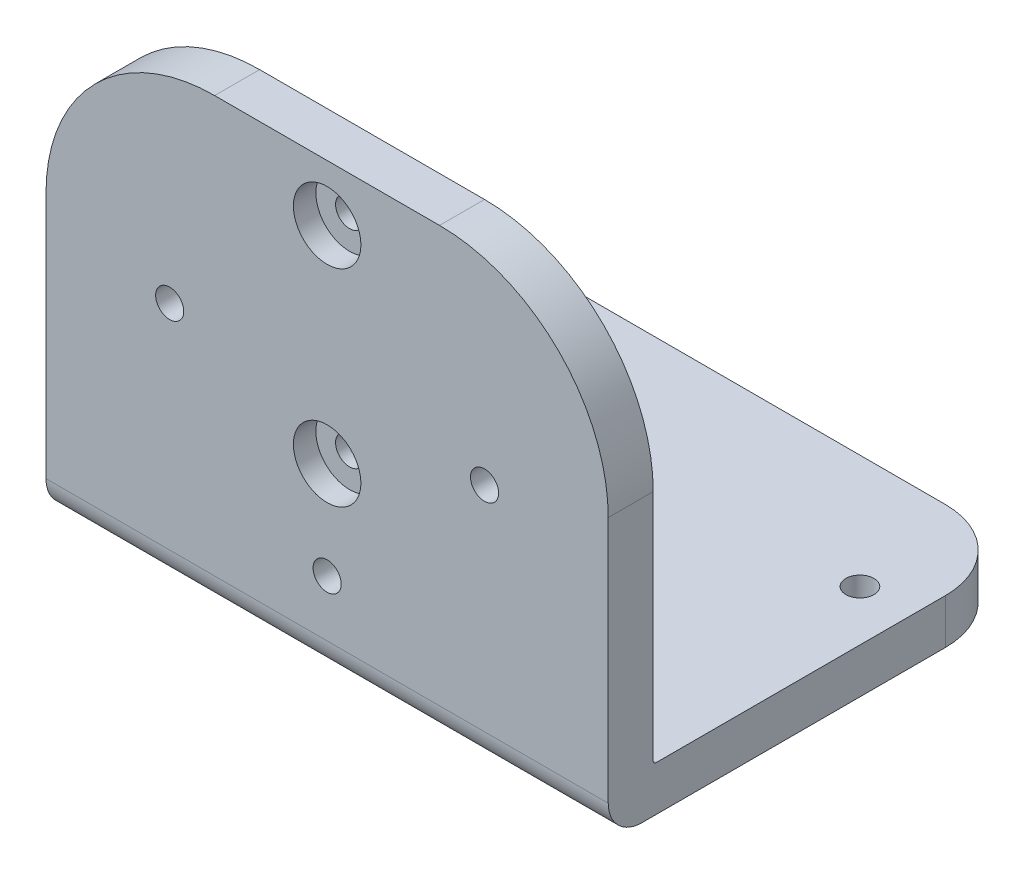
ISO-10303-21;
HEADER;
FILE_DESCRIPTION(('STEP AP214'),'2;1');
FILE_NAME('part.step','',(''),(''),'','','');
FILE_SCHEMA(('AUTOMOTIVE_DESIGN { 1 0 10303 214 1 1 1 1 }'));
ENDSEC;
DATA;
#1=APPLICATION_CONTEXT('core data for automotive mechanical design processes');
#2=APPLICATION_PROTOCOL_DEFINITION('international standard','automotive_design',2000,#1);
#3=PRODUCT_CONTEXT('',#1,'mechanical');
#4=PRODUCT('Part','Part','',(#3));
#5=PRODUCT_RELATED_PRODUCT_CATEGORY('part','',(#4));
#6=PRODUCT_DEFINITION_FORMATION('','',#4);
#7=PRODUCT_DEFINITION_CONTEXT('part definition',#1,'design');
#8=PRODUCT_DEFINITION('design','',#6,#7);
#9=PRODUCT_DEFINITION_SHAPE('','',#8);
#10=(LENGTH_UNIT() NAMED_UNIT(*) SI_UNIT(.MILLI.,.METRE.));
#11=(NAMED_UNIT(*) PLANE_ANGLE_UNIT() SI_UNIT($,.RADIAN.));
#12=(NAMED_UNIT(*) SI_UNIT($,.STERADIAN.) SOLID_ANGLE_UNIT());
#13=UNCERTAINTY_MEASURE_WITH_UNIT(LENGTH_MEASURE(1.E-05),#10,'distance_accuracy_value','');
#14=(GEOMETRIC_REPRESENTATION_CONTEXT(3) GLOBAL_UNCERTAINTY_ASSIGNED_CONTEXT((#13)) GLOBAL_UNIT_ASSIGNED_CONTEXT((#10,
#11,#12)) REPRESENTATION_CONTEXT('',''));
#15=CARTESIAN_POINT('',(0.,0.,0.));
#16=DIRECTION('',(0.,0.,1.));
#17=DIRECTION('',(1.,0.,0.));
#18=AXIS2_PLACEMENT_3D('',#15,#16,#17);
#19=CARTESIAN_POINT('',(25.,0.,0.));
#20=DIRECTION('',(0.,0.,-1.));
#21=DIRECTION('',(-1.,0.,0.));
#22=AXIS2_PLACEMENT_3D('',#19,#20,#21);
#23=PLANE('',#22);
#24=CARTESIAN_POINT('',(0.,16.65,0.));
#25=DIRECTION('',(0.,0.,-1.));
#26=DIRECTION('',(-1.,0.,0.));
#27=AXIS2_PLACEMENT_3D('',#24,#25,#26);
#28=CIRCLE('',#27,3.);
#29=CARTESIAN_POINT('',(-3.00000000000001,16.65,0.));
#30=VERTEX_POINT('',#29);
#31=EDGE_CURVE('E655',#30,#30,#28,.T.);
#32=ORIENTED_EDGE('',*,*,#31,.T.);
#33=EDGE_LOOP('',(#32));
#34=FACE_BOUND('',#33,.T.);
#35=CARTESIAN_POINT('',(0.,35.,0.));
#36=DIRECTION('',(0.,0.,-1.));
#37=DIRECTION('',(-1.,0.,0.));
#38=AXIS2_PLACEMENT_3D('',#35,#36,#37);
#39=CIRCLE('',#38,3.);
#40=CARTESIAN_POINT('',(-3.,35.,0.));
#41=VERTEX_POINT('',#40);
#42=EDGE_CURVE('E648',#41,#41,#39,.T.);
#43=ORIENTED_EDGE('',*,*,#42,.T.);
#44=EDGE_LOOP('',(#43));
#45=FACE_BOUND('',#44,.T.);
#46=CARTESIAN_POINT('',(14.,22.,0.));
#47=DIRECTION('',(0.,0.,-1.));
#48=DIRECTION('',(0.,1.,0.));
#49=AXIS2_PLACEMENT_3D('',#46,#47,#48);
#50=CIRCLE('',#49,1.25);
#51=CARTESIAN_POINT('',(14.,23.25,0.));
#52=VERTEX_POINT('',#51);
#53=EDGE_CURVE('E638',#52,#52,#50,.T.);
#54=ORIENTED_EDGE('',*,*,#53,.T.);
#55=EDGE_LOOP('',(#54));
#56=FACE_BOUND('',#55,.T.);
#57=CARTESIAN_POINT('',(-14.,22.,0.));
#58=DIRECTION('',(0.,0.,-1.));
#59=DIRECTION('',(0.,1.,0.));
#60=AXIS2_PLACEMENT_3D('',#57,#58,#59);
#61=CIRCLE('',#60,1.25);
#62=CARTESIAN_POINT('',(-14.,23.25,0.));
#63=VERTEX_POINT('',#62);
#64=EDGE_CURVE('E642',#63,#63,#61,.T.);
#65=ORIENTED_EDGE('',*,*,#64,.T.);
#66=EDGE_LOOP('',(#65));
#67=FACE_BOUND('',#66,.T.);
#68=CARTESIAN_POINT('',(0.,8.,0.));
#69=DIRECTION('',(0.,0.,-1.));
#70=DIRECTION('',(0.,1.,0.));
#71=AXIS2_PLACEMENT_3D('',#68,#69,#70);
#72=CIRCLE('',#71,1.25);
#73=CARTESIAN_POINT('',(0.,9.25,0.));
#74=VERTEX_POINT('',#73);
#75=EDGE_CURVE('E639',#74,#74,#72,.T.);
#76=ORIENTED_EDGE('',*,*,#75,.T.);
#77=EDGE_LOOP('',(#76));
#78=FACE_BOUND('',#77,.T.);
#79=DIRECTION('',(0.,-1.,0.));
#80=VECTOR('',#79,1.);
#81=CARTESIAN_POINT('',(-25.,0.,0.));
#82=LINE('',#81,#80);
#83=CARTESIAN_POINT('',(-25.,25.,0.));
#84=VERTEX_POINT('',#83);
#85=CARTESIAN_POINT('',(-25.,3.,0.));
#86=VERTEX_POINT('',#85);
#87=EDGE_CURVE('E174',#84,#86,#82,.T.);
#88=ORIENTED_EDGE('',*,*,#87,.T.);
#89=DIRECTION('',(-1.,0.,0.));
#90=VECTOR('',#89,1.);
#91=CARTESIAN_POINT('',(25.,3.,0.));
#92=LINE('',#91,#90);
#93=CARTESIAN_POINT('',(25.,3.,0.));
#94=VERTEX_POINT('',#93);
#95=EDGE_CURVE('E58',#86,#94,#92,.F.);
#96=ORIENTED_EDGE('',*,*,#95,.T.);
#97=DIRECTION('',(0.,-1.,0.));
#98=VECTOR('',#97,1.);
#99=CARTESIAN_POINT('',(25.,0.,0.));
#100=LINE('',#99,#98);
#101=CARTESIAN_POINT('',(25.,25.,0.));
#102=VERTEX_POINT('',#101);
#103=EDGE_CURVE('E152',#102,#94,#100,.T.);
#104=ORIENTED_EDGE('',*,*,#103,.F.);
#105=CARTESIAN_POINT('',(10.,25.,0.));
#106=DIRECTION('',(0.,0.,-1.));
#107=DIRECTION('',(-1.,0.,0.));
#108=AXIS2_PLACEMENT_3D('',#105,#106,#107);
#109=CIRCLE('',#108,15.);
#110=CARTESIAN_POINT('',(10.,40.,0.));
#111=VERTEX_POINT('',#110);
#112=EDGE_CURVE('E139',#102,#111,#109,.F.);
#113=ORIENTED_EDGE('',*,*,#112,.T.);
#114=DIRECTION('',(-1.,0.,0.));
#115=VECTOR('',#114,1.);
#116=CARTESIAN_POINT('',(25.,40.,0.));
#117=LINE('',#116,#115);
#118=CARTESIAN_POINT('',(-10.,40.,0.));
#119=VERTEX_POINT('',#118);
#120=EDGE_CURVE('E173',#111,#119,#117,.T.);
#121=ORIENTED_EDGE('',*,*,#120,.T.);
#122=CARTESIAN_POINT('',(-10.,25.,0.));
#123=DIRECTION('',(0.,0.,-1.));
#124=DIRECTION('',(-1.,0.,0.));
#125=AXIS2_PLACEMENT_3D('',#122,#123,#124);
#126=CIRCLE('',#125,15.);
#127=EDGE_CURVE('E148',#119,#84,#126,.F.);
#128=ORIENTED_EDGE('',*,*,#127,.T.);
#129=EDGE_LOOP('',(#88,#96,#104,#113,#121,#128));
#130=FACE_BOUND('',#129,.T.);
#131=ADVANCED_FACE('F50',(#34,#45,#56,#67,#78,#130),#23,.F.);
#132=CARTESIAN_POINT('',(25.,0.,0.));
#133=DIRECTION('',(0.,1.,0.));
#134=DIRECTION('',(0.,0.,1.));
#135=AXIS2_PLACEMENT_3D('',#132,#133,#134);
#136=PLANE('',#135);
#137=CARTESIAN_POINT('',(20.5,0.,-26.88));
#138=DIRECTION('',(0.,1.,0.));
#139=DIRECTION('',(0.,0.,1.));
#140=AXIS2_PLACEMENT_3D('',#137,#138,#139);
#141=CIRCLE('',#140,3.);
#142=CARTESIAN_POINT('',(20.5,0.,-23.88));
#143=VERTEX_POINT('',#142);
#144=EDGE_CURVE('E177',#143,#143,#141,.T.);
#145=ORIENTED_EDGE('',*,*,#144,.T.);
#146=EDGE_LOOP('',(#145));
#147=FACE_BOUND('',#146,.T.);
#148=CARTESIAN_POINT('',(-15.5,0.,-26.88));
#149=DIRECTION('',(0.,1.,0.));
#150=DIRECTION('',(0.,0.,1.));
#151=AXIS2_PLACEMENT_3D('',#148,#149,#150);
#152=CIRCLE('',#151,3.);
#153=CARTESIAN_POINT('',(-15.5,0.,-23.88));
#154=VERTEX_POINT('',#153);
#155=EDGE_CURVE('E602',#154,#154,#152,.T.);
#156=ORIENTED_EDGE('',*,*,#155,.T.);
#157=EDGE_LOOP('',(#156));
#158=FACE_BOUND('',#157,.T.);
#159=DIRECTION('',(0.,0.,-1.));
#160=VECTOR('',#159,1.);
#161=CARTESIAN_POINT('',(25.,0.,0.));
#162=LINE('',#161,#160);
#163=CARTESIAN_POINT('',(25.,0.,-3.));
#164=VERTEX_POINT('',#163);
#165=CARTESIAN_POINT('',(25.,0.,-30.));
#166=VERTEX_POINT('',#165);
#167=EDGE_CURVE('E159',#164,#166,#162,.T.);
#168=ORIENTED_EDGE('',*,*,#167,.F.);
#169=DIRECTION('',(-1.,0.,0.));
#170=VECTOR('',#169,1.);
#171=CARTESIAN_POINT('',(25.,0.,-3.));
#172=LINE('',#171,#170);
#173=CARTESIAN_POINT('',(-25.,0.,-3.));
#174=VERTEX_POINT('',#173);
#175=EDGE_CURVE('E230',#164,#174,#172,.T.);
#176=ORIENTED_EDGE('',*,*,#175,.T.);
#177=DIRECTION('',(0.,0.,-1.));
#178=VECTOR('',#177,1.);
#179=CARTESIAN_POINT('',(-25.,0.,0.));
#180=LINE('',#179,#178);
#181=CARTESIAN_POINT('',(-25.,0.,-30.));
#182=VERTEX_POINT('',#181);
#183=EDGE_CURVE('E176',#174,#182,#180,.T.);
#184=ORIENTED_EDGE('',*,*,#183,.T.);
#185=CARTESIAN_POINT('',(-18.,0.,-30.));
#186=DIRECTION('',(0.,1.,0.));
#187=DIRECTION('',(0.,0.,1.));
#188=AXIS2_PLACEMENT_3D('',#185,#186,#187);
#189=CIRCLE('',#188,7.);
#190=CARTESIAN_POINT('',(-18.,0.,-37.));
#191=VERTEX_POINT('',#190);
#192=EDGE_CURVE('E216',#182,#191,#189,.F.);
#193=ORIENTED_EDGE('',*,*,#192,.T.);
#194=DIRECTION('',(-1.,0.,0.));
#195=VECTOR('',#194,1.);
#196=CARTESIAN_POINT('',(25.,0.,-37.));
#197=LINE('',#196,#195);
#198=CARTESIAN_POINT('',(18.,0.,-37.));
#199=VERTEX_POINT('',#198);
#200=EDGE_CURVE('E157',#199,#191,#197,.T.);
#201=ORIENTED_EDGE('',*,*,#200,.F.);
#202=CARTESIAN_POINT('',(18.,0.,-30.));
#203=DIRECTION('',(0.,1.,0.));
#204=DIRECTION('',(0.,0.,1.));
#205=AXIS2_PLACEMENT_3D('',#202,#203,#204);
#206=CIRCLE('',#205,7.);
#207=EDGE_CURVE('E213',#199,#166,#206,.F.);
#208=ORIENTED_EDGE('',*,*,#207,.T.);
#209=EDGE_LOOP('',(#168,#176,#184,#193,#201,#208));
#210=FACE_BOUND('',#209,.T.);
#211=ADVANCED_FACE('F236',(#147,#158,#210),#136,.F.);
#212=CARTESIAN_POINT('',(25.,4.,-37.));
#213=DIRECTION('',(0.,0.,1.));
#214=DIRECTION('',(1.,0.,0.));
#215=AXIS2_PLACEMENT_3D('',#212,#213,#214);
#216=PLANE('',#215);
#217=ORIENTED_EDGE('',*,*,#200,.T.);
#218=DIRECTION('',(0.,1.,0.));
#219=VECTOR('',#218,1.);
#220=CARTESIAN_POINT('',(-18.,4.,-37.));
#221=LINE('',#220,#219);
#222=CARTESIAN_POINT('',(-18.,4.,-37.));
#223=VERTEX_POINT('',#222);
#224=EDGE_CURVE('E203',#191,#223,#221,.T.);
#225=ORIENTED_EDGE('',*,*,#224,.T.);
#226=DIRECTION('',(-1.,0.,0.));
#227=VECTOR('',#226,1.);
#228=CARTESIAN_POINT('',(25.,4.,-37.));
#229=LINE('',#228,#227);
#230=CARTESIAN_POINT('',(18.,4.,-37.));
#231=VERTEX_POINT('',#230);
#232=EDGE_CURVE('E185',#231,#223,#229,.T.);
#233=ORIENTED_EDGE('',*,*,#232,.F.);
#234=DIRECTION('',(0.,1.,0.));
#235=VECTOR('',#234,1.);
#236=CARTESIAN_POINT('',(18.,4.,-37.));
#237=LINE('',#236,#235);
#238=EDGE_CURVE('E201',#231,#199,#237,.F.);
#239=ORIENTED_EDGE('',*,*,#238,.T.);
#240=EDGE_LOOP('',(#217,#225,#233,#239));
#241=FACE_BOUND('',#240,.T.);
#242=ADVANCED_FACE('F248',(#241),#216,.F.);
#243=CARTESIAN_POINT('',(25.,4.,-4.));
#244=DIRECTION('',(0.,-1.,0.));
#245=DIRECTION('',(0.,0.,-1.));
#246=AXIS2_PLACEMENT_3D('',#243,#244,#245);
#247=PLANE('',#246);
#248=CARTESIAN_POINT('',(20.5,4.,-26.88));
#249=DIRECTION('',(0.,1.,0.));
#250=DIRECTION('',(0.,0.,1.));
#251=AXIS2_PLACEMENT_3D('',#248,#249,#250);
#252=CIRCLE('',#251,1.25);
#253=CARTESIAN_POINT('',(20.5,4.,-25.63));
#254=VERTEX_POINT('',#253);
#255=EDGE_CURVE('E585',#254,#254,#252,.T.);
#256=ORIENTED_EDGE('',*,*,#255,.F.);
#257=EDGE_LOOP('',(#256));
#258=FACE_BOUND('',#257,.T.);
#259=CARTESIAN_POINT('',(-15.5,4.,-26.88));
#260=DIRECTION('',(0.,1.,0.));
#261=DIRECTION('',(0.,0.,1.));
#262=AXIS2_PLACEMENT_3D('',#259,#260,#261);
#263=CIRCLE('',#262,1.25);
#264=CARTESIAN_POINT('',(-15.5,4.,-25.63));
#265=VERTEX_POINT('',#264);
#266=EDGE_CURVE('E592',#265,#265,#263,.T.);
#267=ORIENTED_EDGE('',*,*,#266,.F.);
#268=EDGE_LOOP('',(#267));
#269=FACE_BOUND('',#268,.T.);
#270=DIRECTION('',(0.,0.,1.));
#271=VECTOR('',#270,1.);
#272=CARTESIAN_POINT('',(-25.,4.,-4.));
#273=LINE('',#272,#271);
#274=CARTESIAN_POINT('',(-25.,4.,-30.));
#275=VERTEX_POINT('',#274);
#276=CARTESIAN_POINT('',(-25.,4.,-4.25));
#277=VERTEX_POINT('',#276);
#278=EDGE_CURVE('E164',#275,#277,#273,.T.);
#279=ORIENTED_EDGE('',*,*,#278,.T.);
#280=DIRECTION('',(-1.,0.,0.));
#281=VECTOR('',#280,1.);
#282=CARTESIAN_POINT('',(25.,4.,-4.25));
#283=LINE('',#282,#281);
#284=CARTESIAN_POINT('',(25.,4.,-4.25));
#285=VERTEX_POINT('',#284);
#286=EDGE_CURVE('E224',#277,#285,#283,.F.);
#287=ORIENTED_EDGE('',*,*,#286,.T.);
#288=DIRECTION('',(0.,0.,1.));
#289=VECTOR('',#288,1.);
#290=CARTESIAN_POINT('',(25.,4.,-4.));
#291=LINE('',#290,#289);
#292=CARTESIAN_POINT('',(25.,4.,-30.));
#293=VERTEX_POINT('',#292);
#294=EDGE_CURVE('E162',#293,#285,#291,.T.);
#295=ORIENTED_EDGE('',*,*,#294,.F.);
#296=CARTESIAN_POINT('',(18.,4.,-30.));
#297=DIRECTION('',(0.,-1.,0.));
#298=DIRECTION('',(0.,0.,-1.));
#299=AXIS2_PLACEMENT_3D('',#296,#297,#298);
#300=CIRCLE('',#299,7.);
#301=EDGE_CURVE('E206',#293,#231,#300,.F.);
#302=ORIENTED_EDGE('',*,*,#301,.T.);
#303=ORIENTED_EDGE('',*,*,#232,.T.);
#304=CARTESIAN_POINT('',(-18.,4.,-30.));
#305=DIRECTION('',(0.,-1.,0.));
#306=DIRECTION('',(0.,0.,-1.));
#307=AXIS2_PLACEMENT_3D('',#304,#305,#306);
#308=CIRCLE('',#307,7.);
#309=EDGE_CURVE('E208',#223,#275,#308,.F.);
#310=ORIENTED_EDGE('',*,*,#309,.T.);
#311=EDGE_LOOP('',(#279,#287,#295,#302,#303,#310));
#312=FACE_BOUND('',#311,.T.);
#313=ADVANCED_FACE('F257',(#258,#269,#312),#247,.F.);
#314=CARTESIAN_POINT('',(25.,40.,-4.));
#315=DIRECTION('',(0.,0.,1.));
#316=DIRECTION('',(0.,-1.,0.));
#317=AXIS2_PLACEMENT_3D('',#314,#315,#316);
#318=PLANE('',#317);
#319=CARTESIAN_POINT('',(0.,35.,-4.));
#320=DIRECTION('',(0.,0.,-1.));
#321=DIRECTION('',(0.,1.,0.));
#322=AXIS2_PLACEMENT_3D('',#319,#320,#321);
#323=CIRCLE('',#322,1.25);
#324=CARTESIAN_POINT('',(0.,36.25,-4.));
#325=VERTEX_POINT('',#324);
#326=EDGE_CURVE('E558',#325,#325,#323,.T.);
#327=ORIENTED_EDGE('',*,*,#326,.F.);
#328=EDGE_LOOP('',(#327));
#329=FACE_BOUND('',#328,.T.);
#330=CARTESIAN_POINT('',(0.,16.65,-4.));
#331=DIRECTION('',(0.,0.,-1.));
#332=DIRECTION('',(0.,1.,0.));
#333=AXIS2_PLACEMENT_3D('',#330,#331,#332);
#334=CIRCLE('',#333,1.25);
#335=CARTESIAN_POINT('',(0.,17.9,-4.));
#336=VERTEX_POINT('',#335);
#337=EDGE_CURVE('E562',#336,#336,#334,.T.);
#338=ORIENTED_EDGE('',*,*,#337,.F.);
#339=EDGE_LOOP('',(#338));
#340=FACE_BOUND('',#339,.T.);
#341=CARTESIAN_POINT('',(-14.,22.,-4.));
#342=DIRECTION('',(0.,0.,-1.));
#343=DIRECTION('',(0.,1.,0.));
#344=AXIS2_PLACEMENT_3D('',#341,#342,#343);
#345=CIRCLE('',#344,3.);
#346=CARTESIAN_POINT('',(-14.,25.,-4.));
#347=VERTEX_POINT('',#346);
#348=EDGE_CURVE('E566',#347,#347,#345,.T.);
#349=ORIENTED_EDGE('',*,*,#348,.F.);
#350=EDGE_LOOP('',(#349));
#351=FACE_BOUND('',#350,.T.);
#352=CARTESIAN_POINT('',(14.,22.,-4.));
#353=DIRECTION('',(0.,0.,-1.));
#354=DIRECTION('',(0.,1.,0.));
#355=AXIS2_PLACEMENT_3D('',#352,#353,#354);
#356=CIRCLE('',#355,3.);
#357=CARTESIAN_POINT('',(14.,25.,-4.));
#358=VERTEX_POINT('',#357);
#359=EDGE_CURVE('E570',#358,#358,#356,.T.);
#360=ORIENTED_EDGE('',*,*,#359,.F.);
#361=EDGE_LOOP('',(#360));
#362=FACE_BOUND('',#361,.T.);
#363=CARTESIAN_POINT('',(0.,8.,-4.));
#364=DIRECTION('',(0.,0.,-1.));
#365=DIRECTION('',(0.,1.,0.));
#366=AXIS2_PLACEMENT_3D('',#363,#364,#365);
#367=CIRCLE('',#366,3.);
#368=CARTESIAN_POINT('',(0.,11.,-4.));
#369=VERTEX_POINT('',#368);
#370=EDGE_CURVE('E573',#369,#369,#367,.T.);
#371=ORIENTED_EDGE('',*,*,#370,.F.);
#372=EDGE_LOOP('',(#371));
#373=FACE_BOUND('',#372,.T.);
#374=DIRECTION('',(0.,1.,0.));
#375=VECTOR('',#374,1.);
#376=CARTESIAN_POINT('',(25.,40.,-4.));
#377=LINE('',#376,#375);
#378=CARTESIAN_POINT('',(25.,4.25,-4.));
#379=VERTEX_POINT('',#378);
#380=CARTESIAN_POINT('',(25.,25.,-4.));
#381=VERTEX_POINT('',#380);
#382=EDGE_CURVE('E155',#379,#381,#377,.T.);
#383=ORIENTED_EDGE('',*,*,#382,.F.);
#384=DIRECTION('',(-1.,0.,0.));
#385=VECTOR('',#384,1.);
#386=CARTESIAN_POINT('',(-25.,4.25,-4.));
#387=LINE('',#386,#385);
#388=CARTESIAN_POINT('',(-25.,4.25,-4.));
#389=VERTEX_POINT('',#388);
#390=EDGE_CURVE('E221',#379,#389,#387,.T.);
#391=ORIENTED_EDGE('',*,*,#390,.T.);
#392=DIRECTION('',(0.,1.,0.));
#393=VECTOR('',#392,1.);
#394=CARTESIAN_POINT('',(-25.,40.,-4.));
#395=LINE('',#394,#393);
#396=CARTESIAN_POINT('',(-25.,25.,-4.));
#397=VERTEX_POINT('',#396);
#398=EDGE_CURVE('E160',#389,#397,#395,.T.);
#399=ORIENTED_EDGE('',*,*,#398,.T.);
#400=CARTESIAN_POINT('',(-10.,25.,-4.));
#401=DIRECTION('',(0.,0.,1.));
#402=DIRECTION('',(0.,-1.,0.));
#403=AXIS2_PLACEMENT_3D('',#400,#401,#402);
#404=CIRCLE('',#403,15.);
#405=CARTESIAN_POINT('',(-10.,40.,-4.));
#406=VERTEX_POINT('',#405);
#407=EDGE_CURVE('E194',#397,#406,#404,.F.);
#408=ORIENTED_EDGE('',*,*,#407,.T.);
#409=DIRECTION('',(-1.,0.,0.));
#410=VECTOR('',#409,1.);
#411=CARTESIAN_POINT('',(25.,40.,-4.));
#412=LINE('',#411,#410);
#413=CARTESIAN_POINT('',(10.,40.,-4.));
#414=VERTEX_POINT('',#413);
#415=EDGE_CURVE('E182',#414,#406,#412,.T.);
#416=ORIENTED_EDGE('',*,*,#415,.F.);
#417=CARTESIAN_POINT('',(10.,25.,-4.));
#418=DIRECTION('',(0.,0.,1.));
#419=DIRECTION('',(0.,-1.,0.));
#420=AXIS2_PLACEMENT_3D('',#417,#418,#419);
#421=CIRCLE('',#420,15.);
#422=EDGE_CURVE('E196',#414,#381,#421,.F.);
#423=ORIENTED_EDGE('',*,*,#422,.T.);
#424=EDGE_LOOP('',(#383,#391,#399,#408,#416,#423));
#425=FACE_BOUND('',#424,.T.);
#426=ADVANCED_FACE('F263',(#329,#340,#351,#362,#373,#425),#318,.F.);
#427=CARTESIAN_POINT('',(25.,40.,0.));
#428=DIRECTION('',(0.,-1.,0.));
#429=DIRECTION('',(0.,0.,-1.));
#430=AXIS2_PLACEMENT_3D('',#427,#428,#429);
#431=PLANE('',#430);
#432=ORIENTED_EDGE('',*,*,#120,.F.);
#433=DIRECTION('',(0.,0.,1.));
#434=VECTOR('',#433,1.);
#435=CARTESIAN_POINT('',(10.,40.,0.));
#436=LINE('',#435,#434);
#437=EDGE_CURVE('E144',#111,#414,#436,.F.);
#438=ORIENTED_EDGE('',*,*,#437,.T.);
#439=ORIENTED_EDGE('',*,*,#415,.T.);
#440=DIRECTION('',(0.,0.,1.));
#441=VECTOR('',#440,1.);
#442=CARTESIAN_POINT('',(-10.,40.,0.));
#443=LINE('',#442,#441);
#444=EDGE_CURVE('E147',#406,#119,#443,.T.);
#445=ORIENTED_EDGE('',*,*,#444,.T.);
#446=EDGE_LOOP('',(#432,#438,#439,#445));
#447=FACE_BOUND('',#446,.T.);
#448=ADVANCED_FACE('F269',(#447),#431,.F.);
#449=CARTESIAN_POINT('',(25.,0.,0.));
#450=DIRECTION('',(-1.,0.,0.));
#451=DIRECTION('',(0.,0.,1.));
#452=AXIS2_PLACEMENT_3D('',#449,#450,#451);
#453=PLANE('',#452);
#454=ORIENTED_EDGE('',*,*,#103,.T.);
#455=CARTESIAN_POINT('',(25.,3.,-3.));
#456=DIRECTION('',(-1.,0.,0.));
#457=DIRECTION('',(0.,0.,1.));
#458=AXIS2_PLACEMENT_3D('',#455,#456,#457);
#459=CIRCLE('',#458,3.);
#460=EDGE_CURVE('E13',#94,#164,#459,.F.);
#461=ORIENTED_EDGE('',*,*,#460,.T.);
#462=ORIENTED_EDGE('',*,*,#167,.T.);
#463=DIRECTION('',(0.,1.,0.));
#464=VECTOR('',#463,1.);
#465=CARTESIAN_POINT('',(25.,0.,-30.));
#466=LINE('',#465,#464);
#467=EDGE_CURVE('E218',#166,#293,#466,.T.);
#468=ORIENTED_EDGE('',*,*,#467,.T.);
#469=ORIENTED_EDGE('',*,*,#294,.T.);
#470=CARTESIAN_POINT('',(25.,4.25,-4.25));
#471=DIRECTION('',(-1.,0.,0.));
#472=DIRECTION('',(0.,0.,1.));
#473=AXIS2_PLACEMENT_3D('',#470,#471,#472);
#474=CIRCLE('',#473,0.25);
#475=EDGE_CURVE('E228',#285,#379,#474,.T.);
#476=ORIENTED_EDGE('',*,*,#475,.T.);
#477=ORIENTED_EDGE('',*,*,#382,.T.);
#478=DIRECTION('',(0.,0.,1.));
#479=VECTOR('',#478,1.);
#480=CARTESIAN_POINT('',(25.,25.,0.));
#481=LINE('',#480,#479);
#482=EDGE_CURVE('E143',#381,#102,#481,.T.);
#483=ORIENTED_EDGE('',*,*,#482,.T.);
#484=EDGE_LOOP('',(#454,#461,#462,#468,#469,#476,#477,#483));
#485=FACE_BOUND('',#484,.T.);
#486=ADVANCED_FACE('F151',(#485),#453,.F.);
#487=CARTESIAN_POINT('',(-25.,0.,0.));
#488=DIRECTION('',(-1.,0.,0.));
#489=DIRECTION('',(0.,0.,1.));
#490=AXIS2_PLACEMENT_3D('',#487,#488,#489);
#491=PLANE('',#490);
#492=ORIENTED_EDGE('',*,*,#183,.F.);
#493=CARTESIAN_POINT('',(-25.,3.,-3.));
#494=DIRECTION('',(-1.,0.,0.));
#495=DIRECTION('',(0.,0.,1.));
#496=AXIS2_PLACEMENT_3D('',#493,#494,#495);
#497=CIRCLE('',#496,3.);
#498=EDGE_CURVE('E72',#174,#86,#497,.T.);
#499=ORIENTED_EDGE('',*,*,#498,.T.);
#500=ORIENTED_EDGE('',*,*,#87,.F.);
#501=DIRECTION('',(0.,0.,1.));
#502=VECTOR('',#501,1.);
#503=CARTESIAN_POINT('',(-25.,25.,-4.));
#504=LINE('',#503,#502);
#505=EDGE_CURVE('E198',#84,#397,#504,.F.);
#506=ORIENTED_EDGE('',*,*,#505,.T.);
#507=ORIENTED_EDGE('',*,*,#398,.F.);
#508=CARTESIAN_POINT('',(-25.,4.25,-4.25));
#509=DIRECTION('',(-1.,0.,0.));
#510=DIRECTION('',(0.,0.,1.));
#511=AXIS2_PLACEMENT_3D('',#508,#509,#510);
#512=CIRCLE('',#511,0.25);
#513=EDGE_CURVE('E226',#389,#277,#512,.F.);
#514=ORIENTED_EDGE('',*,*,#513,.T.);
#515=ORIENTED_EDGE('',*,*,#278,.F.);
#516=DIRECTION('',(0.,1.,0.));
#517=VECTOR('',#516,1.);
#518=CARTESIAN_POINT('',(-25.,0.,-30.));
#519=LINE('',#518,#517);
#520=EDGE_CURVE('E210',#275,#182,#519,.F.);
#521=ORIENTED_EDGE('',*,*,#520,.T.);
#522=EDGE_LOOP('',(#492,#499,#500,#506,#507,#514,#515,#521));
#523=FACE_BOUND('',#522,.T.);
#524=ADVANCED_FACE('F238',(#523),#491,.T.);
#525=CARTESIAN_POINT('',(-15.5,12.4852813742386,-26.88));
#526=DIRECTION('',(0.,-1.,0.));
#527=DIRECTION('',(0.,0.,-1.));
#528=AXIS2_PLACEMENT_3D('',#525,#526,#527);
#529=CYLINDRICAL_SURFACE('',#528,3.);
#530=CARTESIAN_POINT('',(-15.5,2.,-26.88));
#531=DIRECTION('',(0.,-1.,0.));
#532=DIRECTION('',(0.,0.,-1.));
#533=AXIS2_PLACEMENT_3D('',#530,#531,#532);
#534=CIRCLE('',#533,3.);
#535=CARTESIAN_POINT('',(-15.5,2.,-29.88));
#536=VERTEX_POINT('',#535);
#537=EDGE_CURVE('E167',#536,#536,#534,.T.);
#538=ORIENTED_EDGE('',*,*,#537,.F.);
#539=EDGE_LOOP('',(#538));
#540=FACE_BOUND('',#539,.T.);
#541=ORIENTED_EDGE('',*,*,#155,.F.);
#542=EDGE_LOOP('',(#541));
#543=FACE_BOUND('',#542,.T.);
#544=ADVANCED_FACE('F341',(#540,#543),#529,.F.);
#545=CARTESIAN_POINT('',(25.,2.,-4.));
#546=DIRECTION('',(0.,-1.,0.));
#547=DIRECTION('',(0.,0.,-1.));
#548=AXIS2_PLACEMENT_3D('',#545,#546,#547);
#549=PLANE('',#548);
#550=CARTESIAN_POINT('',(-15.5,2.,-26.88));
#551=DIRECTION('',(0.,-1.,0.));
#552=DIRECTION('',(0.,0.,-1.));
#553=AXIS2_PLACEMENT_3D('',#550,#551,#552);
#554=CIRCLE('',#553,1.25);
#555=CARTESIAN_POINT('',(-15.5,2.,-28.13));
#556=VERTEX_POINT('',#555);
#557=EDGE_CURVE('E595',#556,#556,#554,.T.);
#558=ORIENTED_EDGE('',*,*,#557,.F.);
#559=EDGE_LOOP('',(#558));
#560=FACE_BOUND('',#559,.T.);
#561=ORIENTED_EDGE('',*,*,#537,.T.);
#562=EDGE_LOOP('',(#561));
#563=FACE_BOUND('',#562,.T.);
#564=ADVANCED_FACE('F354',(#560,#563),#549,.T.);
#565=CARTESIAN_POINT('',(20.5,12.4852813742386,-26.88));
#566=DIRECTION('',(0.,-1.,0.));
#567=DIRECTION('',(0.,0.,-1.));
#568=AXIS2_PLACEMENT_3D('',#565,#566,#567);
#569=CYLINDRICAL_SURFACE('',#568,3.);
#570=CARTESIAN_POINT('',(20.5,2.,-26.88));
#571=DIRECTION('',(0.,-1.,0.));
#572=DIRECTION('',(0.,0.,-1.));
#573=AXIS2_PLACEMENT_3D('',#570,#571,#572);
#574=CIRCLE('',#573,3.);
#575=CARTESIAN_POINT('',(20.5,2.,-29.88));
#576=VERTEX_POINT('',#575);
#577=EDGE_CURVE('E600',#576,#576,#574,.T.);
#578=ORIENTED_EDGE('',*,*,#577,.F.);
#579=EDGE_LOOP('',(#578));
#580=FACE_BOUND('',#579,.T.);
#581=ORIENTED_EDGE('',*,*,#144,.F.);
#582=EDGE_LOOP('',(#581));
#583=FACE_BOUND('',#582,.T.);
#584=ADVANCED_FACE('F361',(#580,#583),#569,.F.);
#585=CARTESIAN_POINT('',(25.,2.,-4.));
#586=DIRECTION('',(0.,-1.,0.));
#587=DIRECTION('',(0.,0.,-1.));
#588=AXIS2_PLACEMENT_3D('',#585,#586,#587);
#589=PLANE('',#588);
#590=CARTESIAN_POINT('',(20.5,2.,-26.88));
#591=DIRECTION('',(0.,-1.,0.));
#592=DIRECTION('',(0.,0.,-1.));
#593=AXIS2_PLACEMENT_3D('',#590,#591,#592);
#594=CIRCLE('',#593,1.25);
#595=CARTESIAN_POINT('',(20.5,2.,-28.13));
#596=VERTEX_POINT('',#595);
#597=EDGE_CURVE('E588',#596,#596,#594,.T.);
#598=ORIENTED_EDGE('',*,*,#597,.F.);
#599=EDGE_LOOP('',(#598));
#600=FACE_BOUND('',#599,.T.);
#601=ORIENTED_EDGE('',*,*,#577,.T.);
#602=EDGE_LOOP('',(#601));
#603=FACE_BOUND('',#602,.T.);
#604=ADVANCED_FACE('F369',(#600,#603),#589,.T.);
#605=CARTESIAN_POINT('',(-15.5,0.,-26.88));
#606=DIRECTION('',(0.,1.,0.));
#607=DIRECTION('',(0.,0.,1.));
#608=AXIS2_PLACEMENT_3D('',#605,#606,#607);
#609=CYLINDRICAL_SURFACE('',#608,1.25);
#610=ORIENTED_EDGE('',*,*,#557,.T.);
#611=EDGE_LOOP('',(#610));
#612=FACE_BOUND('',#611,.T.);
#613=ORIENTED_EDGE('',*,*,#266,.T.);
#614=EDGE_LOOP('',(#613));
#615=FACE_BOUND('',#614,.T.);
#616=ADVANCED_FACE('F377',(#612,#615),#609,.F.);
#617=CARTESIAN_POINT('',(20.5,0.,-26.88));
#618=DIRECTION('',(0.,1.,0.));
#619=DIRECTION('',(0.,0.,1.));
#620=AXIS2_PLACEMENT_3D('',#617,#618,#619);
#621=CYLINDRICAL_SURFACE('',#620,1.25);
#622=ORIENTED_EDGE('',*,*,#597,.T.);
#623=EDGE_LOOP('',(#622));
#624=FACE_BOUND('',#623,.T.);
#625=ORIENTED_EDGE('',*,*,#255,.T.);
#626=EDGE_LOOP('',(#625));
#627=FACE_BOUND('',#626,.T.);
#628=ADVANCED_FACE('F385',(#624,#627),#621,.F.);
#629=CARTESIAN_POINT('',(0.,8.,-2.));
#630=DIRECTION('',(0.,0.,-1.));
#631=DIRECTION('',(0.,1.,0.));
#632=AXIS2_PLACEMENT_3D('',#629,#630,#631);
#633=CYLINDRICAL_SURFACE('',#632,3.);
#634=CARTESIAN_POINT('',(0.,8.,-2.));
#635=DIRECTION('',(0.,0.,-1.));
#636=DIRECTION('',(0.,1.,0.));
#637=AXIS2_PLACEMENT_3D('',#634,#635,#636);
#638=CIRCLE('',#637,3.);
#639=CARTESIAN_POINT('',(0.,11.,-2.));
#640=VERTEX_POINT('',#639);
#641=EDGE_CURVE('E575',#640,#640,#638,.T.);
#642=ORIENTED_EDGE('',*,*,#641,.F.);
#643=EDGE_LOOP('',(#642));
#644=FACE_BOUND('',#643,.T.);
#645=ORIENTED_EDGE('',*,*,#370,.T.);
#646=EDGE_LOOP('',(#645));
#647=FACE_BOUND('',#646,.T.);
#648=ADVANCED_FACE('F393',(#644,#647),#633,.F.);
#649=CARTESIAN_POINT('',(0.,0.,-2.));
#650=DIRECTION('',(0.,0.,-1.));
#651=DIRECTION('',(0.,1.,0.));
#652=AXIS2_PLACEMENT_3D('',#649,#650,#651);
#653=PLANE('',#652);
#654=CARTESIAN_POINT('',(0.,8.,-2.));
#655=DIRECTION('',(0.,0.,-1.));
#656=DIRECTION('',(0.,1.,0.));
#657=AXIS2_PLACEMENT_3D('',#654,#655,#656);
#658=CIRCLE('',#657,1.25);
#659=CARTESIAN_POINT('',(0.,9.25,-2.));
#660=VERTEX_POINT('',#659);
#661=EDGE_CURVE('E576',#660,#660,#658,.T.);
#662=ORIENTED_EDGE('',*,*,#661,.F.);
#663=EDGE_LOOP('',(#662));
#664=FACE_BOUND('',#663,.T.);
#665=ORIENTED_EDGE('',*,*,#641,.T.);
#666=EDGE_LOOP('',(#665));
#667=FACE_BOUND('',#666,.T.);
#668=ADVANCED_FACE('F401',(#664,#667),#653,.T.);
#669=CARTESIAN_POINT('',(14.,22.,-2.));
#670=DIRECTION('',(0.,0.,-1.));
#671=DIRECTION('',(0.,1.,0.));
#672=AXIS2_PLACEMENT_3D('',#669,#670,#671);
#673=CYLINDRICAL_SURFACE('',#672,3.);
#674=CARTESIAN_POINT('',(14.,22.,-2.));
#675=DIRECTION('',(0.,0.,-1.));
#676=DIRECTION('',(0.,1.,0.));
#677=AXIS2_PLACEMENT_3D('',#674,#675,#676);
#678=CIRCLE('',#677,3.);
#679=CARTESIAN_POINT('',(14.,25.,-2.));
#680=VERTEX_POINT('',#679);
#681=EDGE_CURVE('E625',#680,#680,#678,.T.);
#682=ORIENTED_EDGE('',*,*,#681,.F.);
#683=EDGE_LOOP('',(#682));
#684=FACE_BOUND('',#683,.T.);
#685=ORIENTED_EDGE('',*,*,#359,.T.);
#686=EDGE_LOOP('',(#685));
#687=FACE_BOUND('',#686,.T.);
#688=ADVANCED_FACE('F409',(#684,#687),#673,.F.);
#689=CARTESIAN_POINT('',(0.,0.,-2.));
#690=DIRECTION('',(0.,0.,-1.));
#691=DIRECTION('',(0.,1.,0.));
#692=AXIS2_PLACEMENT_3D('',#689,#690,#691);
#693=PLANE('',#692);
#694=CARTESIAN_POINT('',(14.,22.,-2.));
#695=DIRECTION('',(0.,0.,-1.));
#696=DIRECTION('',(0.,1.,0.));
#697=AXIS2_PLACEMENT_3D('',#694,#695,#696);
#698=CIRCLE('',#697,1.25);
#699=CARTESIAN_POINT('',(14.,23.25,-2.));
#700=VERTEX_POINT('',#699);
#701=EDGE_CURVE('E581',#700,#700,#698,.T.);
#702=ORIENTED_EDGE('',*,*,#701,.F.);
#703=EDGE_LOOP('',(#702));
#704=FACE_BOUND('',#703,.T.);
#705=ORIENTED_EDGE('',*,*,#681,.T.);
#706=EDGE_LOOP('',(#705));
#707=FACE_BOUND('',#706,.T.);
#708=ADVANCED_FACE('F417',(#704,#707),#693,.T.);
#709=CARTESIAN_POINT('',(-14.,22.,-2.));
#710=DIRECTION('',(0.,0.,-1.));
#711=DIRECTION('',(0.,1.,0.));
#712=AXIS2_PLACEMENT_3D('',#709,#710,#711);
#713=CYLINDRICAL_SURFACE('',#712,3.);
#714=CARTESIAN_POINT('',(-14.,22.,-2.));
#715=DIRECTION('',(0.,0.,-1.));
#716=DIRECTION('',(0.,1.,0.));
#717=AXIS2_PLACEMENT_3D('',#714,#715,#716);
#718=CIRCLE('',#717,3.);
#719=CARTESIAN_POINT('',(-14.,25.,-2.));
#720=VERTEX_POINT('',#719);
#721=EDGE_CURVE('E589',#720,#720,#718,.T.);
#722=ORIENTED_EDGE('',*,*,#721,.F.);
#723=EDGE_LOOP('',(#722));
#724=FACE_BOUND('',#723,.T.);
#725=ORIENTED_EDGE('',*,*,#348,.T.);
#726=EDGE_LOOP('',(#725));
#727=FACE_BOUND('',#726,.T.);
#728=ADVANCED_FACE('F425',(#724,#727),#713,.F.);
#729=CARTESIAN_POINT('',(0.,0.,-2.));
#730=DIRECTION('',(0.,0.,-1.));
#731=DIRECTION('',(0.,1.,0.));
#732=AXIS2_PLACEMENT_3D('',#729,#730,#731);
#733=PLANE('',#732);
#734=CARTESIAN_POINT('',(-14.,22.,-2.));
#735=DIRECTION('',(0.,0.,-1.));
#736=DIRECTION('',(0.,1.,0.));
#737=AXIS2_PLACEMENT_3D('',#734,#735,#736);
#738=CIRCLE('',#737,1.25);
#739=CARTESIAN_POINT('',(-14.,23.25,-2.));
#740=VERTEX_POINT('',#739);
#741=EDGE_CURVE('E635',#740,#740,#738,.T.);
#742=ORIENTED_EDGE('',*,*,#741,.F.);
#743=EDGE_LOOP('',(#742));
#744=FACE_BOUND('',#743,.T.);
#745=ORIENTED_EDGE('',*,*,#721,.T.);
#746=EDGE_LOOP('',(#745));
#747=FACE_BOUND('',#746,.T.);
#748=ADVANCED_FACE('F433',(#744,#747),#733,.T.);
#749=CARTESIAN_POINT('',(-14.,22.,0.));
#750=DIRECTION('',(0.,0.,-1.));
#751=DIRECTION('',(0.,1.,0.));
#752=AXIS2_PLACEMENT_3D('',#749,#750,#751);
#753=CYLINDRICAL_SURFACE('',#752,1.25);
#754=ORIENTED_EDGE('',*,*,#741,.T.);
#755=EDGE_LOOP('',(#754));
#756=FACE_BOUND('',#755,.T.);
#757=ORIENTED_EDGE('',*,*,#64,.F.);
#758=EDGE_LOOP('',(#757));
#759=FACE_BOUND('',#758,.T.);
#760=ADVANCED_FACE('F441',(#756,#759),#753,.F.);
#761=CARTESIAN_POINT('',(14.,22.,0.));
#762=DIRECTION('',(0.,0.,-1.));
#763=DIRECTION('',(0.,1.,0.));
#764=AXIS2_PLACEMENT_3D('',#761,#762,#763);
#765=CYLINDRICAL_SURFACE('',#764,1.25);
#766=ORIENTED_EDGE('',*,*,#701,.T.);
#767=EDGE_LOOP('',(#766));
#768=FACE_BOUND('',#767,.T.);
#769=ORIENTED_EDGE('',*,*,#53,.F.);
#770=EDGE_LOOP('',(#769));
#771=FACE_BOUND('',#770,.T.);
#772=ADVANCED_FACE('F449',(#768,#771),#765,.F.);
#773=CARTESIAN_POINT('',(0.,8.,0.));
#774=DIRECTION('',(0.,0.,-1.));
#775=DIRECTION('',(0.,1.,0.));
#776=AXIS2_PLACEMENT_3D('',#773,#774,#775);
#777=CYLINDRICAL_SURFACE('',#776,1.25);
#778=ORIENTED_EDGE('',*,*,#661,.T.);
#779=EDGE_LOOP('',(#778));
#780=FACE_BOUND('',#779,.T.);
#781=ORIENTED_EDGE('',*,*,#75,.F.);
#782=EDGE_LOOP('',(#781));
#783=FACE_BOUND('',#782,.T.);
#784=ADVANCED_FACE('F457',(#780,#783),#777,.F.);
#785=CARTESIAN_POINT('',(0.,35.,-2.));
#786=DIRECTION('',(0.,0.,-1.));
#787=DIRECTION('',(-1.,0.,0.));
#788=AXIS2_PLACEMENT_3D('',#785,#786,#787);
#789=PLANE('',#788);
#790=CARTESIAN_POINT('',(0.,35.,-2.));
#791=DIRECTION('',(0.,0.,-1.));
#792=DIRECTION('',(-1.,0.,0.));
#793=AXIS2_PLACEMENT_3D('',#790,#791,#792);
#794=CIRCLE('',#793,3.);
#795=CARTESIAN_POINT('',(-3.,35.,-2.));
#796=VERTEX_POINT('',#795);
#797=EDGE_CURVE('E651',#796,#796,#794,.T.);
#798=ORIENTED_EDGE('',*,*,#797,.F.);
#799=EDGE_LOOP('',(#798));
#800=FACE_BOUND('',#799,.T.);
#801=CARTESIAN_POINT('',(0.,35.,-2.));
#802=DIRECTION('',(0.,0.,-1.));
#803=DIRECTION('',(-1.,0.,0.));
#804=AXIS2_PLACEMENT_3D('',#801,#802,#803);
#805=CIRCLE('',#804,1.25);
#806=CARTESIAN_POINT('',(-1.25,35.,-2.));
#807=VERTEX_POINT('',#806);
#808=EDGE_CURVE('E652',#807,#807,#805,.T.);
#809=ORIENTED_EDGE('',*,*,#808,.T.);
#810=EDGE_LOOP('',(#809));
#811=FACE_BOUND('',#810,.T.);
#812=ADVANCED_FACE('F465',(#800,#811),#789,.F.);
#813=CARTESIAN_POINT('',(0.,35.,-2.));
#814=DIRECTION('',(0.,0.,1.));
#815=DIRECTION('',(0.,-1.,0.));
#816=AXIS2_PLACEMENT_3D('',#813,#814,#815);
#817=CYLINDRICAL_SURFACE('',#816,3.);
#818=ORIENTED_EDGE('',*,*,#797,.T.);
#819=EDGE_LOOP('',(#818));
#820=FACE_BOUND('',#819,.T.);
#821=ORIENTED_EDGE('',*,*,#42,.F.);
#822=EDGE_LOOP('',(#821));
#823=FACE_BOUND('',#822,.T.);
#824=ADVANCED_FACE('F473',(#820,#823),#817,.F.);
#825=CARTESIAN_POINT('',(0.,16.65,-2.));
#826=DIRECTION('',(0.,0.,-1.));
#827=DIRECTION('',(-1.,0.,0.));
#828=AXIS2_PLACEMENT_3D('',#825,#826,#827);
#829=PLANE('',#828);
#830=CARTESIAN_POINT('',(0.,16.65,-2.));
#831=DIRECTION('',(0.,0.,-1.));
#832=DIRECTION('',(-1.,0.,0.));
#833=AXIS2_PLACEMENT_3D('',#830,#831,#832);
#834=CIRCLE('',#833,3.);
#835=CARTESIAN_POINT('',(-3.00000000000001,16.65,-2.));
#836=VERTEX_POINT('',#835);
#837=EDGE_CURVE('E643',#836,#836,#834,.T.);
#838=ORIENTED_EDGE('',*,*,#837,.F.);
#839=EDGE_LOOP('',(#838));
#840=FACE_BOUND('',#839,.T.);
#841=CARTESIAN_POINT('',(0.,16.65,-2.));
#842=DIRECTION('',(0.,0.,-1.));
#843=DIRECTION('',(-1.,0.,0.));
#844=AXIS2_PLACEMENT_3D('',#841,#842,#843);
#845=CIRCLE('',#844,1.25);
#846=CARTESIAN_POINT('',(-1.25000000000001,16.65,-2.));
#847=VERTEX_POINT('',#846);
#848=EDGE_CURVE('E661',#847,#847,#845,.T.);
#849=ORIENTED_EDGE('',*,*,#848,.T.);
#850=EDGE_LOOP('',(#849));
#851=FACE_BOUND('',#850,.T.);
#852=ADVANCED_FACE('F481',(#840,#851),#829,.F.);
#853=CARTESIAN_POINT('',(0.,16.65,-2.));
#854=DIRECTION('',(0.,0.,1.));
#855=DIRECTION('',(0.,-1.,0.));
#856=AXIS2_PLACEMENT_3D('',#853,#854,#855);
#857=CYLINDRICAL_SURFACE('',#856,3.);
#858=ORIENTED_EDGE('',*,*,#837,.T.);
#859=EDGE_LOOP('',(#858));
#860=FACE_BOUND('',#859,.T.);
#861=ORIENTED_EDGE('',*,*,#31,.F.);
#862=EDGE_LOOP('',(#861));
#863=FACE_BOUND('',#862,.T.);
#864=ADVANCED_FACE('F489',(#860,#863),#857,.F.);
#865=CARTESIAN_POINT('',(0.,16.65,0.));
#866=DIRECTION('',(0.,0.,-1.));
#867=DIRECTION('',(0.,1.,0.));
#868=AXIS2_PLACEMENT_3D('',#865,#866,#867);
#869=CYLINDRICAL_SURFACE('',#868,1.25);
#870=ORIENTED_EDGE('',*,*,#337,.T.);
#871=EDGE_LOOP('',(#870));
#872=FACE_BOUND('',#871,.T.);
#873=ORIENTED_EDGE('',*,*,#848,.F.);
#874=EDGE_LOOP('',(#873));
#875=FACE_BOUND('',#874,.T.);
#876=ADVANCED_FACE('F497',(#872,#875),#869,.F.);
#877=CARTESIAN_POINT('',(0.,35.,0.));
#878=DIRECTION('',(0.,0.,-1.));
#879=DIRECTION('',(0.,1.,0.));
#880=AXIS2_PLACEMENT_3D('',#877,#878,#879);
#881=CYLINDRICAL_SURFACE('',#880,1.25);
#882=ORIENTED_EDGE('',*,*,#326,.T.);
#883=EDGE_LOOP('',(#882));
#884=FACE_BOUND('',#883,.T.);
#885=ORIENTED_EDGE('',*,*,#808,.F.);
#886=EDGE_LOOP('',(#885));
#887=FACE_BOUND('',#886,.T.);
#888=ADVANCED_FACE('F291',(#884,#887),#881,.F.);
#889=CARTESIAN_POINT('',(10.,25.,0.));
#890=DIRECTION('',(0.,0.,1.));
#891=DIRECTION('',(1.,0.,0.));
#892=AXIS2_PLACEMENT_3D('',#889,#890,#891);
#893=CYLINDRICAL_SURFACE('',#892,15.);
#894=ORIENTED_EDGE('',*,*,#422,.F.);
#895=ORIENTED_EDGE('',*,*,#437,.F.);
#896=ORIENTED_EDGE('',*,*,#112,.F.);
#897=ORIENTED_EDGE('',*,*,#482,.F.);
#898=EDGE_LOOP('',(#894,#895,#896,#897));
#899=FACE_BOUND('',#898,.T.);
#900=ADVANCED_FACE('F142',(#899),#893,.T.);
#901=CARTESIAN_POINT('',(-10.,25.,0.));
#902=DIRECTION('',(0.,0.,-1.));
#903=DIRECTION('',(-1.,0.,0.));
#904=AXIS2_PLACEMENT_3D('',#901,#902,#903);
#905=CYLINDRICAL_SURFACE('',#904,15.);
#906=ORIENTED_EDGE('',*,*,#407,.F.);
#907=ORIENTED_EDGE('',*,*,#505,.F.);
#908=ORIENTED_EDGE('',*,*,#127,.F.);
#909=ORIENTED_EDGE('',*,*,#444,.F.);
#910=EDGE_LOOP('',(#906,#907,#908,#909));
#911=FACE_BOUND('',#910,.T.);
#912=ADVANCED_FACE('F271',(#911),#905,.T.);
#913=CARTESIAN_POINT('',(-18.,4.,-30.));
#914=DIRECTION('',(0.,-1.,0.));
#915=DIRECTION('',(0.,0.,-1.));
#916=AXIS2_PLACEMENT_3D('',#913,#914,#915);
#917=CYLINDRICAL_SURFACE('',#916,7.);
#918=ORIENTED_EDGE('',*,*,#192,.F.);
#919=ORIENTED_EDGE('',*,*,#520,.F.);
#920=ORIENTED_EDGE('',*,*,#309,.F.);
#921=ORIENTED_EDGE('',*,*,#224,.F.);
#922=EDGE_LOOP('',(#918,#919,#920,#921));
#923=FACE_BOUND('',#922,.T.);
#924=ADVANCED_FACE('F244',(#923),#917,.T.);
#925=CARTESIAN_POINT('',(18.,0.,-30.));
#926=DIRECTION('',(0.,1.,0.));
#927=DIRECTION('',(0.,0.,1.));
#928=AXIS2_PLACEMENT_3D('',#925,#926,#927);
#929=CYLINDRICAL_SURFACE('',#928,7.);
#930=ORIENTED_EDGE('',*,*,#207,.F.);
#931=ORIENTED_EDGE('',*,*,#238,.F.);
#932=ORIENTED_EDGE('',*,*,#301,.F.);
#933=ORIENTED_EDGE('',*,*,#467,.F.);
#934=EDGE_LOOP('',(#930,#931,#932,#933));
#935=FACE_BOUND('',#934,.T.);
#936=ADVANCED_FACE('F252',(#935),#929,.T.);
#937=CARTESIAN_POINT('',(25.,4.25,-4.25));
#938=DIRECTION('',(1.,0.,0.));
#939=DIRECTION('',(0.,0.,-1.));
#940=AXIS2_PLACEMENT_3D('',#937,#938,#939);
#941=CYLINDRICAL_SURFACE('',#940,0.25);
#942=ORIENTED_EDGE('',*,*,#475,.F.);
#943=ORIENTED_EDGE('',*,*,#286,.F.);
#944=ORIENTED_EDGE('',*,*,#513,.F.);
#945=ORIENTED_EDGE('',*,*,#390,.F.);
#946=EDGE_LOOP('',(#942,#943,#944,#945));
#947=FACE_BOUND('',#946,.T.);
#948=ADVANCED_FACE('F260',(#947),#941,.F.);
#949=CARTESIAN_POINT('',(25.,3.,-3.));
#950=DIRECTION('',(-1.,0.,0.));
#951=DIRECTION('',(0.,0.,1.));
#952=AXIS2_PLACEMENT_3D('',#949,#950,#951);
#953=CYLINDRICAL_SURFACE('',#952,3.);
#954=ORIENTED_EDGE('',*,*,#460,.F.);
#955=ORIENTED_EDGE('',*,*,#95,.F.);
#956=ORIENTED_EDGE('',*,*,#498,.F.);
#957=ORIENTED_EDGE('',*,*,#175,.F.);
#958=EDGE_LOOP('',(#954,#955,#956,#957));
#959=FACE_BOUND('',#958,.T.);
#960=ADVANCED_FACE('F52',(#959),#953,.T.);
#961=CLOSED_SHELL('',(#131,#211,#242,#313,#426,#448,#486,#524,#544,#564,#584,#604,#616,#628,
#648,#668,#688,#708,#728,#748,#760,#772,#784,#812,#824,#852,#864,#876,#888,#900,#912,#924,#936,
#948,#960));
#962=MANIFOLD_SOLID_BREP('B2',#961);
#963=ADVANCED_BREP_SHAPE_REPRESENTATION('',(#18,#962),#14);
#964=SHAPE_DEFINITION_REPRESENTATION(#9,#963);
ENDSEC;
END-ISO-10303-21;
